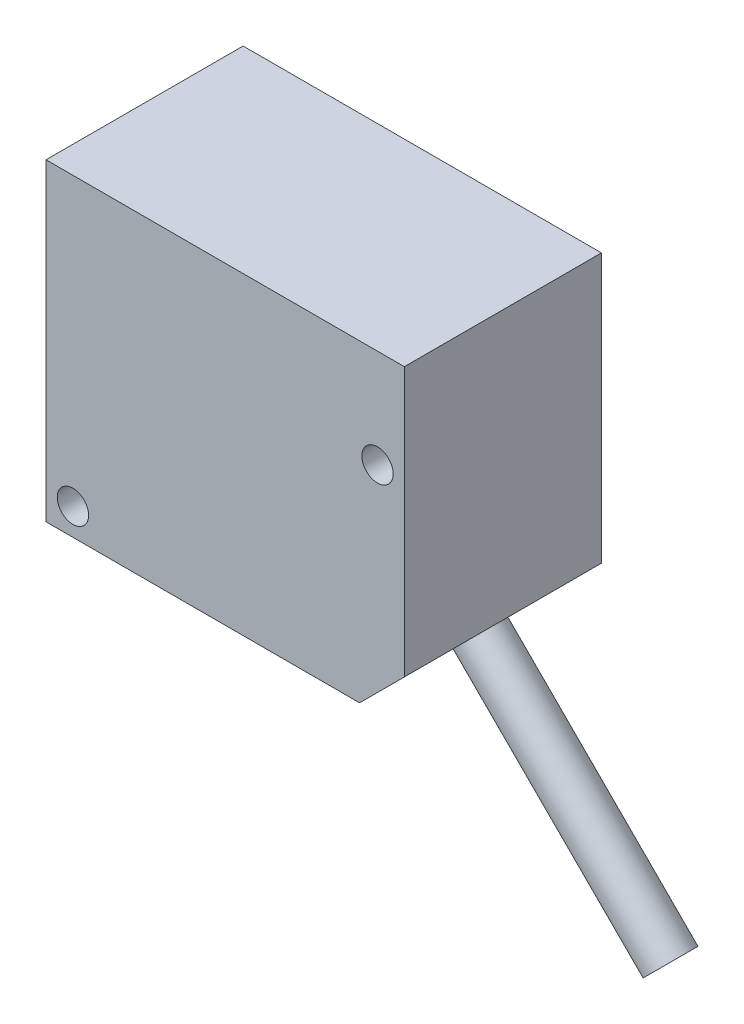
ISO-10303-21;
HEADER;
FILE_DESCRIPTION(('STEP AP214'),'2;1');
FILE_NAME('part.step','',(''),(''),'','','');
FILE_SCHEMA(('AUTOMOTIVE_DESIGN { 1 0 10303 214 1 1 1 1 }'));
ENDSEC;
DATA;
#1=APPLICATION_CONTEXT('core data for automotive mechanical design processes');
#2=APPLICATION_PROTOCOL_DEFINITION('international standard','automotive_design',2000,#1);
#3=PRODUCT_CONTEXT('',#1,'mechanical');
#4=PRODUCT('Part','Part','',(#3));
#5=PRODUCT_RELATED_PRODUCT_CATEGORY('part','',(#4));
#6=PRODUCT_DEFINITION_FORMATION('','',#4);
#7=PRODUCT_DEFINITION_CONTEXT('part definition',#1,'design');
#8=PRODUCT_DEFINITION('design','',#6,#7);
#9=PRODUCT_DEFINITION_SHAPE('','',#8);
#10=(LENGTH_UNIT() NAMED_UNIT(*) SI_UNIT(.MILLI.,.METRE.));
#11=(NAMED_UNIT(*) PLANE_ANGLE_UNIT() SI_UNIT($,.RADIAN.));
#12=(NAMED_UNIT(*) SI_UNIT($,.STERADIAN.) SOLID_ANGLE_UNIT());
#13=UNCERTAINTY_MEASURE_WITH_UNIT(LENGTH_MEASURE(1.E-05),#10,'distance_accuracy_value','');
#14=(GEOMETRIC_REPRESENTATION_CONTEXT(3) GLOBAL_UNCERTAINTY_ASSIGNED_CONTEXT((#13)) GLOBAL_UNIT_ASSIGNED_CONTEXT((#10,
#11,#12)) REPRESENTATION_CONTEXT('',''));
#15=CARTESIAN_POINT('',(0.,0.,0.));
#16=DIRECTION('',(0.,0.,1.));
#17=DIRECTION('',(1.,0.,0.));
#18=AXIS2_PLACEMENT_3D('',#15,#16,#17);
#19=CARTESIAN_POINT('',(-20.,17.5,22.));
#20=DIRECTION('',(1.,0.,0.));
#21=DIRECTION('',(0.,0.,-1.));
#22=AXIS2_PLACEMENT_3D('',#19,#20,#21);
#23=PLANE('',#22);
#24=DIRECTION('',(0.,0.,-1.));
#25=VECTOR('',#24,1.);
#26=CARTESIAN_POINT('',(-20.,13.2707243452482,3.78822839007348));
#27=LINE('',#26,#25);
#28=CARTESIAN_POINT('',(-20.,13.2707243452482,18.2117716099265));
#29=VERTEX_POINT('',#28);
#30=CARTESIAN_POINT('',(-20.,13.2707243452482,3.78822839007348));
#31=VERTEX_POINT('',#30);
#32=EDGE_CURVE('E138',#29,#31,#27,.T.);
#33=ORIENTED_EDGE('',*,*,#32,.F.);
#34=DIRECTION('',(0.,1.,0.));
#35=VECTOR('',#34,1.);
#36=CARTESIAN_POINT('',(-20.,13.2707243452482,18.2117716099265));
#37=LINE('',#36,#35);
#38=CARTESIAN_POINT('',(-20.,-13.2707243452482,18.2117716099265));
#39=VERTEX_POINT('',#38);
#40=EDGE_CURVE('E54',#39,#29,#37,.T.);
#41=ORIENTED_EDGE('',*,*,#40,.F.);
#42=DIRECTION('',(0.,0.,1.));
#43=VECTOR('',#42,1.);
#44=CARTESIAN_POINT('',(-20.,-13.2707243452482,3.78822839007348));
#45=LINE('',#44,#43);
#46=CARTESIAN_POINT('',(-20.,-13.2707243452482,3.78822839007348));
#47=VERTEX_POINT('',#46);
#48=EDGE_CURVE('E129',#47,#39,#45,.T.);
#49=ORIENTED_EDGE('',*,*,#48,.F.);
#50=DIRECTION('',(0.,-1.,0.));
#51=VECTOR('',#50,1.);
#52=CARTESIAN_POINT('',(-20.,13.2707243452482,3.78822839007348));
#53=LINE('',#52,#51);
#54=EDGE_CURVE('E132',#31,#47,#53,.T.);
#55=ORIENTED_EDGE('',*,*,#54,.F.);
#56=EDGE_LOOP('',(#33,#41,#49,#55));
#57=FACE_BOUND('',#56,.T.);
#58=DIRECTION('',(0.,-1.,0.));
#59=VECTOR('',#58,1.);
#60=CARTESIAN_POINT('',(-20.,17.5,0.));
#61=LINE('',#60,#59);
#62=CARTESIAN_POINT('',(-20.,17.5,0.));
#63=VERTEX_POINT('',#62);
#64=CARTESIAN_POINT('',(-20.,-17.5,0.));
#65=VERTEX_POINT('',#64);
#66=EDGE_CURVE('E163',#63,#65,#61,.T.);
#67=ORIENTED_EDGE('',*,*,#66,.T.);
#68=DIRECTION('',(0.,0.,-1.));
#69=VECTOR('',#68,1.);
#70=CARTESIAN_POINT('',(-20.,-17.5,22.));
#71=LINE('',#70,#69);
#72=CARTESIAN_POINT('',(-20.,-17.5,22.));
#73=VERTEX_POINT('',#72);
#74=EDGE_CURVE('E189',#73,#65,#71,.T.);
#75=ORIENTED_EDGE('',*,*,#74,.F.);
#76=DIRECTION('',(0.,-1.,0.));
#77=VECTOR('',#76,1.);
#78=CARTESIAN_POINT('',(-20.,17.5,22.));
#79=LINE('',#78,#77);
#80=CARTESIAN_POINT('',(-20.,17.5,22.));
#81=VERTEX_POINT('',#80);
#82=EDGE_CURVE('E166',#81,#73,#79,.T.);
#83=ORIENTED_EDGE('',*,*,#82,.F.);
#84=DIRECTION('',(0.,0.,-1.));
#85=VECTOR('',#84,1.);
#86=CARTESIAN_POINT('',(-20.,17.5,22.));
#87=LINE('',#86,#85);
#88=EDGE_CURVE('E176',#81,#63,#87,.T.);
#89=ORIENTED_EDGE('',*,*,#88,.T.);
#90=EDGE_LOOP('',(#67,#75,#83,#89));
#91=FACE_BOUND('',#90,.T.);
#92=ADVANCED_FACE('F39',(#57,#91),#23,.F.);
#93=CARTESIAN_POINT('',(20.,-17.5,22.));
#94=DIRECTION('',(0.,1.,0.));
#95=DIRECTION('',(0.,0.,1.));
#96=AXIS2_PLACEMENT_3D('',#93,#94,#95);
#97=PLANE('',#96);
#98=DIRECTION('',(1.,0.,0.));
#99=VECTOR('',#98,1.);
#100=CARTESIAN_POINT('',(20.,-17.5,0.));
#101=LINE('',#100,#99);
#102=CARTESIAN_POINT('',(15.,-17.5,0.));
#103=VERTEX_POINT('',#102);
#104=EDGE_CURVE('E179',#65,#103,#101,.T.);
#105=ORIENTED_EDGE('',*,*,#104,.T.);
#106=DIRECTION('',(0.,0.,1.));
#107=VECTOR('',#106,1.);
#108=CARTESIAN_POINT('',(15.,-17.5,22.));
#109=LINE('',#108,#107);
#110=CARTESIAN_POINT('',(15.,-17.5,22.));
#111=VERTEX_POINT('',#110);
#112=EDGE_CURVE('E47',#103,#111,#109,.T.);
#113=ORIENTED_EDGE('',*,*,#112,.T.);
#114=DIRECTION('',(1.,0.,0.));
#115=VECTOR('',#114,1.);
#116=CARTESIAN_POINT('',(20.,-17.5,22.));
#117=LINE('',#116,#115);
#118=EDGE_CURVE('E169',#73,#111,#117,.T.);
#119=ORIENTED_EDGE('',*,*,#118,.F.);
#120=ORIENTED_EDGE('',*,*,#74,.T.);
#121=EDGE_LOOP('',(#105,#113,#119,#120));
#122=FACE_BOUND('',#121,.T.);
#123=ADVANCED_FACE('F203',(#122),#97,.F.);
#124=CARTESIAN_POINT('',(20.,17.5,22.));
#125=DIRECTION('',(-1.,0.,0.));
#126=DIRECTION('',(0.,-1.,0.));
#127=AXIS2_PLACEMENT_3D('',#124,#125,#126);
#128=PLANE('',#127);
#129=DIRECTION('',(0.,1.,0.));
#130=VECTOR('',#129,1.);
#131=CARTESIAN_POINT('',(20.,17.5,22.));
#132=LINE('',#131,#130);
#133=CARTESIAN_POINT('',(20.,-12.5,22.));
#134=VERTEX_POINT('',#133);
#135=CARTESIAN_POINT('',(20.,17.5,22.));
#136=VERTEX_POINT('',#135);
#137=EDGE_CURVE('E172',#134,#136,#132,.T.);
#138=ORIENTED_EDGE('',*,*,#137,.F.);
#139=DIRECTION('',(0.,0.,-1.));
#140=VECTOR('',#139,1.);
#141=CARTESIAN_POINT('',(20.,-12.5,22.));
#142=LINE('',#141,#140);
#143=CARTESIAN_POINT('',(20.,-12.5,0.));
#144=VERTEX_POINT('',#143);
#145=EDGE_CURVE('E192',#134,#144,#142,.T.);
#146=ORIENTED_EDGE('',*,*,#145,.T.);
#147=DIRECTION('',(0.,1.,0.));
#148=VECTOR('',#147,1.);
#149=CARTESIAN_POINT('',(20.,17.5,0.));
#150=LINE('',#149,#148);
#151=CARTESIAN_POINT('',(20.,17.5,0.));
#152=VERTEX_POINT('',#151);
#153=EDGE_CURVE('E181',#144,#152,#150,.T.);
#154=ORIENTED_EDGE('',*,*,#153,.T.);
#155=DIRECTION('',(0.,0.,-1.));
#156=VECTOR('',#155,1.);
#157=CARTESIAN_POINT('',(20.,17.5,22.));
#158=LINE('',#157,#156);
#159=EDGE_CURVE('E186',#136,#152,#158,.T.);
#160=ORIENTED_EDGE('',*,*,#159,.F.);
#161=EDGE_LOOP('',(#138,#146,#154,#160));
#162=FACE_BOUND('',#161,.T.);
#163=ADVANCED_FACE('F211',(#162),#128,.F.);
#164=CARTESIAN_POINT('',(20.,17.5,22.));
#165=DIRECTION('',(0.,-1.,0.));
#166=DIRECTION('',(0.,0.,-1.));
#167=AXIS2_PLACEMENT_3D('',#164,#165,#166);
#168=PLANE('',#167);
#169=DIRECTION('',(-1.,0.,0.));
#170=VECTOR('',#169,1.);
#171=CARTESIAN_POINT('',(20.,17.5,0.));
#172=LINE('',#171,#170);
#173=EDGE_CURVE('E170',#152,#63,#172,.T.);
#174=ORIENTED_EDGE('',*,*,#173,.T.);
#175=ORIENTED_EDGE('',*,*,#88,.F.);
#176=DIRECTION('',(-1.,0.,0.));
#177=VECTOR('',#176,1.);
#178=CARTESIAN_POINT('',(20.,17.5,22.));
#179=LINE('',#178,#177);
#180=EDGE_CURVE('E174',#136,#81,#179,.T.);
#181=ORIENTED_EDGE('',*,*,#180,.F.);
#182=ORIENTED_EDGE('',*,*,#159,.T.);
#183=EDGE_LOOP('',(#174,#175,#181,#182));
#184=FACE_BOUND('',#183,.T.);
#185=ADVANCED_FACE('F215',(#184),#168,.F.);
#186=CARTESIAN_POINT('',(0.,0.,22.));
#187=DIRECTION('',(0.,0.,-1.));
#188=DIRECTION('',(-1.,0.,0.));
#189=AXIS2_PLACEMENT_3D('',#186,#187,#188);
#190=PLANE('',#189);
#191=CARTESIAN_POINT('',(-17.,-14.5,22.));
#192=DIRECTION('',(0.,0.,1.));
#193=DIRECTION('',(1.,0.,0.));
#194=AXIS2_PLACEMENT_3D('',#191,#192,#193);
#195=CIRCLE('',#194,1.75);
#196=CARTESIAN_POINT('',(-15.25,-14.5,22.));
#197=VERTEX_POINT('',#196);
#198=EDGE_CURVE('E151',#197,#197,#195,.T.);
#199=ORIENTED_EDGE('',*,*,#198,.F.);
#200=EDGE_LOOP('',(#199));
#201=FACE_BOUND('',#200,.T.);
#202=CARTESIAN_POINT('',(17.,6.49999999999999,22.));
#203=DIRECTION('',(0.,0.,1.));
#204=DIRECTION('',(1.,0.,0.));
#205=AXIS2_PLACEMENT_3D('',#202,#203,#204);
#206=CIRCLE('',#205,1.75);
#207=CARTESIAN_POINT('',(18.75,6.49999999999999,22.));
#208=VERTEX_POINT('',#207);
#209=EDGE_CURVE('E157',#208,#208,#206,.T.);
#210=ORIENTED_EDGE('',*,*,#209,.F.);
#211=EDGE_LOOP('',(#210));
#212=FACE_BOUND('',#211,.T.);
#213=ORIENTED_EDGE('',*,*,#118,.T.);
#214=DIRECTION('',(-0.707106781186549,-0.707106781186547,0.));
#215=VECTOR('',#214,1.);
#216=CARTESIAN_POINT('',(20.,-12.5,22.));
#217=LINE('',#216,#215);
#218=EDGE_CURVE('E11',#111,#134,#217,.F.);
#219=ORIENTED_EDGE('',*,*,#218,.T.);
#220=ORIENTED_EDGE('',*,*,#137,.T.);
#221=ORIENTED_EDGE('',*,*,#180,.T.);
#222=ORIENTED_EDGE('',*,*,#82,.T.);
#223=EDGE_LOOP('',(#213,#219,#220,#221,#222));
#224=FACE_BOUND('',#223,.T.);
#225=ADVANCED_FACE('F208',(#201,#212,#224),#190,.F.);
#226=CARTESIAN_POINT('',(0.,0.,0.));
#227=DIRECTION('',(0.,0.,-1.));
#228=DIRECTION('',(-1.,0.,0.));
#229=AXIS2_PLACEMENT_3D('',#226,#227,#228);
#230=PLANE('',#229);
#231=CARTESIAN_POINT('',(-17.,-14.5,0.));
#232=DIRECTION('',(0.,0.,1.));
#233=DIRECTION('',(1.,0.,0.));
#234=AXIS2_PLACEMENT_3D('',#231,#232,#233);
#235=CIRCLE('',#234,1.75);
#236=CARTESIAN_POINT('',(-15.25,-14.5,0.));
#237=VERTEX_POINT('',#236);
#238=EDGE_CURVE('E154',#237,#237,#235,.T.);
#239=ORIENTED_EDGE('',*,*,#238,.T.);
#240=EDGE_LOOP('',(#239));
#241=FACE_BOUND('',#240,.T.);
#242=CARTESIAN_POINT('',(17.,6.49999999999999,0.));
#243=DIRECTION('',(0.,0.,1.));
#244=DIRECTION('',(1.,0.,0.));
#245=AXIS2_PLACEMENT_3D('',#242,#243,#244);
#246=CIRCLE('',#245,1.75);
#247=CARTESIAN_POINT('',(18.75,6.49999999999999,0.));
#248=VERTEX_POINT('',#247);
#249=EDGE_CURVE('E160',#248,#248,#246,.T.);
#250=ORIENTED_EDGE('',*,*,#249,.T.);
#251=EDGE_LOOP('',(#250));
#252=FACE_BOUND('',#251,.T.);
#253=ORIENTED_EDGE('',*,*,#153,.F.);
#254=DIRECTION('',(0.707106781186549,0.707106781186547,0.));
#255=VECTOR('',#254,1.);
#256=CARTESIAN_POINT('',(16.25,-16.25,0.));
#257=LINE('',#256,#255);
#258=EDGE_CURVE('E195',#144,#103,#257,.F.);
#259=ORIENTED_EDGE('',*,*,#258,.T.);
#260=ORIENTED_EDGE('',*,*,#104,.F.);
#261=ORIENTED_EDGE('',*,*,#66,.F.);
#262=ORIENTED_EDGE('',*,*,#173,.F.);
#263=EDGE_LOOP('',(#253,#259,#260,#261,#262));
#264=FACE_BOUND('',#263,.T.);
#265=ADVANCED_FACE('F198',(#241,#252,#264),#230,.T.);
#266=CARTESIAN_POINT('',(17.,6.49999999999999,0.));
#267=DIRECTION('',(0.,0.,1.));
#268=DIRECTION('',(1.,0.,0.));
#269=AXIS2_PLACEMENT_3D('',#266,#267,#268);
#270=CYLINDRICAL_SURFACE('',#269,1.75);
#271=ORIENTED_EDGE('',*,*,#249,.F.);
#272=EDGE_LOOP('',(#271));
#273=FACE_BOUND('',#272,.T.);
#274=ORIENTED_EDGE('',*,*,#209,.T.);
#275=EDGE_LOOP('',(#274));
#276=FACE_BOUND('',#275,.T.);
#277=ADVANCED_FACE('F231',(#273,#276),#270,.F.);
#278=CARTESIAN_POINT('',(-17.,-14.5,0.));
#279=DIRECTION('',(0.,0.,1.));
#280=DIRECTION('',(1.,0.,0.));
#281=AXIS2_PLACEMENT_3D('',#278,#279,#280);
#282=CYLINDRICAL_SURFACE('',#281,1.75);
#283=ORIENTED_EDGE('',*,*,#238,.F.);
#284=EDGE_LOOP('',(#283));
#285=FACE_BOUND('',#284,.T.);
#286=ORIENTED_EDGE('',*,*,#198,.T.);
#287=EDGE_LOOP('',(#286));
#288=FACE_BOUND('',#287,.T.);
#289=ADVANCED_FACE('F238',(#285,#288),#282,.F.);
#290=CARTESIAN_POINT('',(20.,-12.5,22.));
#291=DIRECTION('',(-0.707106781186547,0.707106781186549,0.));
#292=DIRECTION('',(0.,0.,-1.));
#293=AXIS2_PLACEMENT_3D('',#290,#291,#292);
#294=PLANE('',#293);
#295=CARTESIAN_POINT('',(17.5,-15.,11.));
#296=DIRECTION('',(0.707106781186547,-0.707106781186548,0.));
#297=DIRECTION('',(0.707106781186548,0.707106781186547,0.));
#298=AXIS2_PLACEMENT_3D('',#295,#296,#297);
#299=CIRCLE('',#298,2.5);
#300=CARTESIAN_POINT('',(19.2677669529664,-13.2322330470336,11.));
#301=VERTEX_POINT('',#300);
#302=EDGE_CURVE('E144',#301,#301,#299,.T.);
#303=ORIENTED_EDGE('',*,*,#302,.F.);
#304=EDGE_LOOP('',(#303));
#305=FACE_BOUND('',#304,.T.);
#306=ORIENTED_EDGE('',*,*,#218,.F.);
#307=ORIENTED_EDGE('',*,*,#112,.F.);
#308=ORIENTED_EDGE('',*,*,#258,.F.);
#309=ORIENTED_EDGE('',*,*,#145,.F.);
#310=EDGE_LOOP('',(#306,#307,#308,#309));
#311=FACE_BOUND('',#310,.T.);
#312=ADVANCED_FACE('F41',(#305,#311),#294,.F.);
#313=CARTESIAN_POINT('',(38.7132034355964,-36.2132034355965,11.));
#314=DIRECTION('',(-0.707106781186547,0.707106781186548,0.));
#315=DIRECTION('',(-0.707106781186548,-0.707106781186547,0.));
#316=AXIS2_PLACEMENT_3D('',#313,#314,#315);
#317=CYLINDRICAL_SURFACE('',#316,2.5);
#318=CARTESIAN_POINT('',(38.7132034355964,-36.2132034355965,11.));
#319=DIRECTION('',(0.707106781186547,-0.707106781186548,0.));
#320=DIRECTION('',(0.707106781186548,0.707106781186547,0.));
#321=AXIS2_PLACEMENT_3D('',#318,#319,#320);
#322=CIRCLE('',#321,2.5);
#323=CARTESIAN_POINT('',(40.4809703885628,-34.4454364826301,11.));
#324=VERTEX_POINT('',#323);
#325=EDGE_CURVE('E148',#324,#324,#322,.T.);
#326=ORIENTED_EDGE('',*,*,#325,.F.);
#327=EDGE_LOOP('',(#326));
#328=FACE_BOUND('',#327,.T.);
#329=ORIENTED_EDGE('',*,*,#302,.T.);
#330=EDGE_LOOP('',(#329));
#331=FACE_BOUND('',#330,.T.);
#332=ADVANCED_FACE('F243',(#328,#331),#317,.T.);
#333=CARTESIAN_POINT('',(38.7132034355964,-36.2132034355965,11.));
#334=DIRECTION('',(0.707106781186547,-0.707106781186548,0.));
#335=DIRECTION('',(0.707106781186548,0.707106781186547,0.));
#336=AXIS2_PLACEMENT_3D('',#333,#334,#335);
#337=PLANE('',#336);
#338=ORIENTED_EDGE('',*,*,#325,.T.);
#339=EDGE_LOOP('',(#338));
#340=FACE_BOUND('',#339,.T.);
#341=ADVANCED_FACE('F246',(#340),#337,.T.);
#342=CARTESIAN_POINT('',(-19.9,13.2707243452482,18.2117716099265));
#343=DIRECTION('',(0.,0.,1.));
#344=DIRECTION('',(1.,0.,0.));
#345=AXIS2_PLACEMENT_3D('',#342,#343,#344);
#346=PLANE('',#345);
#347=ORIENTED_EDGE('',*,*,#40,.T.);
#348=DIRECTION('',(-1.,0.,0.));
#349=VECTOR('',#348,1.);
#350=CARTESIAN_POINT('',(-19.9,13.2707243452482,18.2117716099265));
#351=LINE('',#350,#349);
#352=CARTESIAN_POINT('',(-19.9,13.2707243452482,18.2117716099265));
#353=VERTEX_POINT('',#352);
#354=EDGE_CURVE('E107',#353,#29,#351,.T.);
#355=ORIENTED_EDGE('',*,*,#354,.F.);
#356=DIRECTION('',(0.,1.,0.));
#357=VECTOR('',#356,1.);
#358=CARTESIAN_POINT('',(-19.9,13.2707243452482,18.2117716099265));
#359=LINE('',#358,#357);
#360=CARTESIAN_POINT('',(-19.9,-13.2707243452482,18.2117716099265));
#361=VERTEX_POINT('',#360);
#362=EDGE_CURVE('E111',#361,#353,#359,.T.);
#363=ORIENTED_EDGE('',*,*,#362,.F.);
#364=DIRECTION('',(-1.,0.,0.));
#365=VECTOR('',#364,1.);
#366=CARTESIAN_POINT('',(-19.9,-13.2707243452482,18.2117716099265));
#367=LINE('',#366,#365);
#368=EDGE_CURVE('E142',#361,#39,#367,.T.);
#369=ORIENTED_EDGE('',*,*,#368,.T.);
#370=EDGE_LOOP('',(#347,#355,#363,#369));
#371=FACE_BOUND('',#370,.T.);
#372=ADVANCED_FACE('F109',(#371),#346,.F.);
#373=CARTESIAN_POINT('',(-19.9,-13.2707243452482,3.78822839007348));
#374=DIRECTION('',(0.,-1.,0.));
#375=DIRECTION('',(0.,0.,-1.));
#376=AXIS2_PLACEMENT_3D('',#373,#374,#375);
#377=PLANE('',#376);
#378=ORIENTED_EDGE('',*,*,#48,.T.);
#379=ORIENTED_EDGE('',*,*,#368,.F.);
#380=DIRECTION('',(0.,0.,1.));
#381=VECTOR('',#380,1.);
#382=CARTESIAN_POINT('',(-19.9,-13.2707243452482,3.78822839007348));
#383=LINE('',#382,#381);
#384=CARTESIAN_POINT('',(-19.9,-13.2707243452482,3.78822839007348));
#385=VERTEX_POINT('',#384);
#386=EDGE_CURVE('E117',#385,#361,#383,.T.);
#387=ORIENTED_EDGE('',*,*,#386,.F.);
#388=DIRECTION('',(-1.,0.,0.));
#389=VECTOR('',#388,1.);
#390=CARTESIAN_POINT('',(-19.9,-13.2707243452482,3.78822839007348));
#391=LINE('',#390,#389);
#392=EDGE_CURVE('E145',#385,#47,#391,.T.);
#393=ORIENTED_EDGE('',*,*,#392,.T.);
#394=EDGE_LOOP('',(#378,#379,#387,#393));
#395=FACE_BOUND('',#394,.T.);
#396=ADVANCED_FACE('F253',(#395),#377,.F.);
#397=CARTESIAN_POINT('',(-19.9,13.2707243452482,3.78822839007348));
#398=DIRECTION('',(0.,0.,-1.));
#399=DIRECTION('',(-1.,0.,0.));
#400=AXIS2_PLACEMENT_3D('',#397,#398,#399);
#401=PLANE('',#400);
#402=ORIENTED_EDGE('',*,*,#54,.T.);
#403=ORIENTED_EDGE('',*,*,#392,.F.);
#404=DIRECTION('',(0.,-1.,0.));
#405=VECTOR('',#404,1.);
#406=CARTESIAN_POINT('',(-19.9,13.2707243452482,3.78822839007348));
#407=LINE('',#406,#405);
#408=CARTESIAN_POINT('',(-19.9,13.2707243452482,3.78822839007348));
#409=VERTEX_POINT('',#408);
#410=EDGE_CURVE('E125',#409,#385,#407,.T.);
#411=ORIENTED_EDGE('',*,*,#410,.F.);
#412=DIRECTION('',(-1.,0.,0.));
#413=VECTOR('',#412,1.);
#414=CARTESIAN_POINT('',(-19.9,13.2707243452482,3.78822839007348));
#415=LINE('',#414,#413);
#416=EDGE_CURVE('E116',#409,#31,#415,.T.);
#417=ORIENTED_EDGE('',*,*,#416,.T.);
#418=EDGE_LOOP('',(#402,#403,#411,#417));
#419=FACE_BOUND('',#418,.T.);
#420=ADVANCED_FACE('F256',(#419),#401,.F.);
#421=CARTESIAN_POINT('',(-19.9,13.2707243452482,3.78822839007348));
#422=DIRECTION('',(0.,1.,0.));
#423=DIRECTION('',(0.,0.,1.));
#424=AXIS2_PLACEMENT_3D('',#421,#422,#423);
#425=PLANE('',#424);
#426=ORIENTED_EDGE('',*,*,#32,.T.);
#427=ORIENTED_EDGE('',*,*,#416,.F.);
#428=DIRECTION('',(0.,0.,-1.));
#429=VECTOR('',#428,1.);
#430=CARTESIAN_POINT('',(-19.9,13.2707243452482,3.78822839007348));
#431=LINE('',#430,#429);
#432=EDGE_CURVE('E120',#353,#409,#431,.T.);
#433=ORIENTED_EDGE('',*,*,#432,.F.);
#434=ORIENTED_EDGE('',*,*,#354,.T.);
#435=EDGE_LOOP('',(#426,#427,#433,#434));
#436=FACE_BOUND('',#435,.T.);
#437=ADVANCED_FACE('F121',(#436),#425,.F.);
#438=CARTESIAN_POINT('',(-19.9,0.,0.));
#439=DIRECTION('',(-1.,0.,0.));
#440=DIRECTION('',(0.,0.,1.));
#441=AXIS2_PLACEMENT_3D('',#438,#439,#440);
#442=PLANE('',#441);
#443=ORIENTED_EDGE('',*,*,#362,.T.);
#444=ORIENTED_EDGE('',*,*,#432,.T.);
#445=ORIENTED_EDGE('',*,*,#410,.T.);
#446=ORIENTED_EDGE('',*,*,#386,.T.);
#447=EDGE_LOOP('',(#443,#444,#445,#446));
#448=FACE_BOUND('',#447,.T.);
#449=ADVANCED_FACE('F127',(#448),#442,.T.);
#450=CLOSED_SHELL('',(#92,#123,#163,#185,#225,#265,#277,#289,#312,#332,#341,#372,#396,#420,#437,#449));
#451=MANIFOLD_SOLID_BREP('B2',#450);
#452=ADVANCED_BREP_SHAPE_REPRESENTATION('',(#18,#451),#14);
#453=SHAPE_DEFINITION_REPRESENTATION(#9,#452);
ENDSEC;
END-ISO-10303-21;
